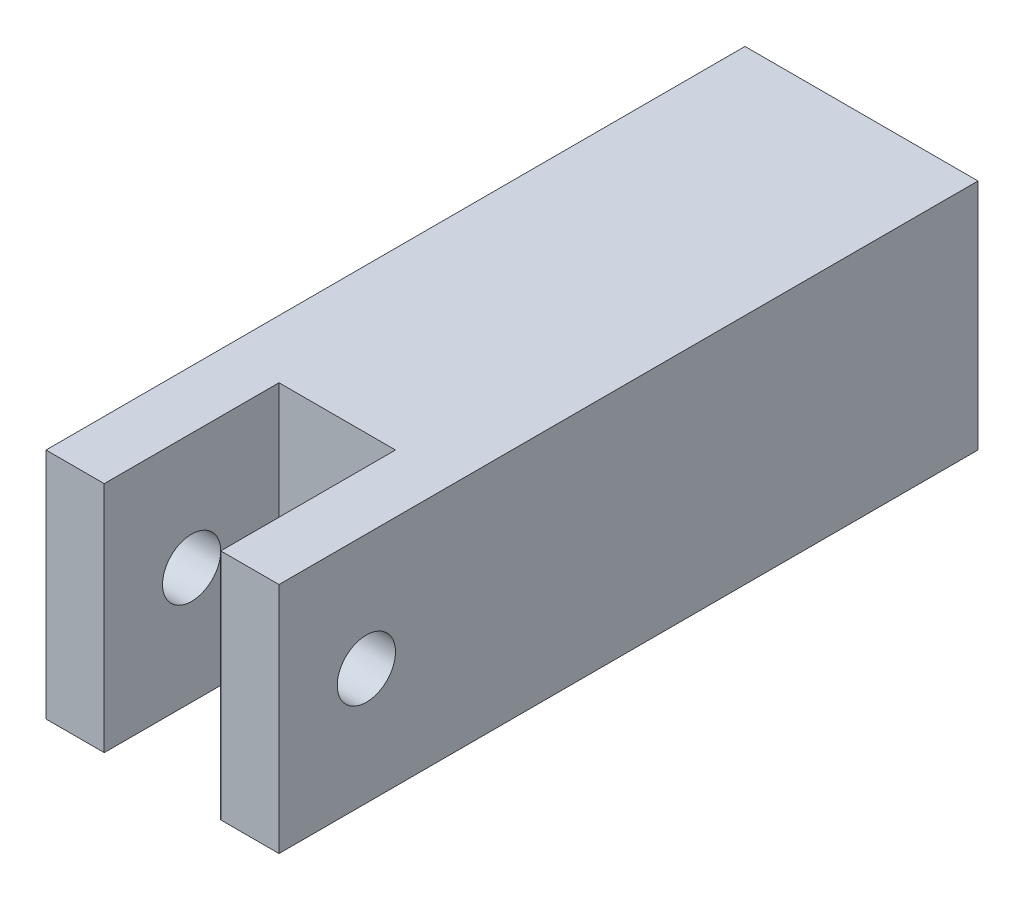
ISO-10303-21;
HEADER;
FILE_DESCRIPTION(('STEP AP214'),'2;1');
FILE_NAME('part.step','',(''),(''),'','','');
FILE_SCHEMA(('AUTOMOTIVE_DESIGN { 1 0 10303 214 1 1 1 1 }'));
ENDSEC;
DATA;
#1=APPLICATION_CONTEXT('core data for automotive mechanical design processes');
#2=APPLICATION_PROTOCOL_DEFINITION('international standard','automotive_design',2000,#1);
#3=PRODUCT_CONTEXT('',#1,'mechanical');
#4=PRODUCT('Part','Part','',(#3));
#5=PRODUCT_RELATED_PRODUCT_CATEGORY('part','',(#4));
#6=PRODUCT_DEFINITION_FORMATION('','',#4);
#7=PRODUCT_DEFINITION_CONTEXT('part definition',#1,'design');
#8=PRODUCT_DEFINITION('design','',#6,#7);
#9=PRODUCT_DEFINITION_SHAPE('','',#8);
#10=(LENGTH_UNIT() NAMED_UNIT(*) SI_UNIT(.MILLI.,.METRE.));
#11=(NAMED_UNIT(*) PLANE_ANGLE_UNIT() SI_UNIT($,.RADIAN.));
#12=(NAMED_UNIT(*) SI_UNIT($,.STERADIAN.) SOLID_ANGLE_UNIT());
#13=UNCERTAINTY_MEASURE_WITH_UNIT(LENGTH_MEASURE(1.E-05),#10,'distance_accuracy_value','');
#14=(GEOMETRIC_REPRESENTATION_CONTEXT(3) GLOBAL_UNCERTAINTY_ASSIGNED_CONTEXT((#13)) GLOBAL_UNIT_ASSIGNED_CONTEXT((#10,
#11,#12)) REPRESENTATION_CONTEXT('',''));
#15=CARTESIAN_POINT('',(0.,0.,0.));
#16=DIRECTION('',(0.,0.,1.));
#17=DIRECTION('',(1.,0.,0.));
#18=AXIS2_PLACEMENT_3D('',#15,#16,#17);
#19=CARTESIAN_POINT('',(0.,0.,90.));
#20=DIRECTION('',(0.,0.,1.));
#21=DIRECTION('',(1.,0.,0.));
#22=AXIS2_PLACEMENT_3D('',#19,#20,#21);
#23=PLANE('',#22);
#24=DIRECTION('',(-1.,0.,0.));
#25=VECTOR('',#24,1.);
#26=CARTESIAN_POINT('',(-20.,20.,90.));
#27=LINE('',#26,#25);
#28=CARTESIAN_POINT('',(10.,20.,90.));
#29=VERTEX_POINT('',#28);
#30=CARTESIAN_POINT('',(-9.99999999999999,20.,90.));
#31=VERTEX_POINT('',#30);
#32=EDGE_CURVE('E60',#29,#31,#27,.T.);
#33=ORIENTED_EDGE('',*,*,#32,.T.);
#34=DIRECTION('',(0.,1.,0.));
#35=VECTOR('',#34,1.);
#36=CARTESIAN_POINT('',(-9.99999999999999,-20.,90.));
#37=LINE('',#36,#35);
#38=CARTESIAN_POINT('',(-9.99999999999999,-20.,90.));
#39=VERTEX_POINT('',#38);
#40=EDGE_CURVE('E55',#39,#31,#37,.T.);
#41=ORIENTED_EDGE('',*,*,#40,.F.);
#42=DIRECTION('',(1.,0.,0.));
#43=VECTOR('',#42,1.);
#44=CARTESIAN_POINT('',(-20.,-20.,90.));
#45=LINE('',#44,#43);
#46=CARTESIAN_POINT('',(10.,-20.,90.));
#47=VERTEX_POINT('',#46);
#48=EDGE_CURVE('E152',#39,#47,#45,.T.);
#49=ORIENTED_EDGE('',*,*,#48,.T.);
#50=DIRECTION('',(0.,-1.,0.));
#51=VECTOR('',#50,1.);
#52=CARTESIAN_POINT('',(10.,-20.,90.));
#53=LINE('',#52,#51);
#54=EDGE_CURVE('E127',#29,#47,#53,.T.);
#55=ORIENTED_EDGE('',*,*,#54,.F.);
#56=EDGE_LOOP('',(#33,#41,#49,#55));
#57=FACE_BOUND('',#56,.T.);
#58=ADVANCED_FACE('F39',(#57),#23,.T.);
#59=CARTESIAN_POINT('',(20.,20.,90.));
#60=DIRECTION('',(-1.,0.,0.));
#61=DIRECTION('',(0.,-1.,0.));
#62=AXIS2_PLACEMENT_3D('',#59,#60,#61);
#63=PLANE('',#62);
#64=CARTESIAN_POINT('',(20.,0.,105.));
#65=DIRECTION('',(-1.,0.,0.));
#66=DIRECTION('',(0.,-1.,0.));
#67=AXIS2_PLACEMENT_3D('',#64,#65,#66);
#68=CIRCLE('',#67,5.);
#69=CARTESIAN_POINT('',(20.,-5.,105.));
#70=VERTEX_POINT('',#69);
#71=EDGE_CURVE('E195',#70,#70,#68,.T.);
#72=ORIENTED_EDGE('',*,*,#71,.T.);
#73=EDGE_LOOP('',(#72));
#74=FACE_BOUND('',#73,.T.);
#75=DIRECTION('',(0.,1.,0.));
#76=VECTOR('',#75,1.);
#77=CARTESIAN_POINT('',(20.,20.,0.));
#78=LINE('',#77,#76);
#79=CARTESIAN_POINT('',(20.,-20.,0.));
#80=VERTEX_POINT('',#79);
#81=CARTESIAN_POINT('',(20.,20.,0.));
#82=VERTEX_POINT('',#81);
#83=EDGE_CURVE('E150',#80,#82,#78,.T.);
#84=ORIENTED_EDGE('',*,*,#83,.T.);
#85=DIRECTION('',(0.,0.,-1.));
#86=VECTOR('',#85,1.);
#87=CARTESIAN_POINT('',(20.,20.,90.));
#88=LINE('',#87,#86);
#89=CARTESIAN_POINT('',(20.,20.,120.));
#90=VERTEX_POINT('',#89);
#91=EDGE_CURVE('E11',#90,#82,#88,.T.);
#92=ORIENTED_EDGE('',*,*,#91,.F.);
#93=DIRECTION('',(0.,1.,0.));
#94=VECTOR('',#93,1.);
#95=CARTESIAN_POINT('',(20.,-20.,120.));
#96=LINE('',#95,#94);
#97=CARTESIAN_POINT('',(20.,-20.,120.));
#98=VERTEX_POINT('',#97);
#99=EDGE_CURVE('E132',#98,#90,#96,.T.);
#100=ORIENTED_EDGE('',*,*,#99,.F.);
#101=DIRECTION('',(0.,0.,-1.));
#102=VECTOR('',#101,1.);
#103=CARTESIAN_POINT('',(20.,-20.,90.));
#104=LINE('',#103,#102);
#105=EDGE_CURVE('E155',#98,#80,#104,.T.);
#106=ORIENTED_EDGE('',*,*,#105,.T.);
#107=EDGE_LOOP('',(#84,#92,#100,#106));
#108=FACE_BOUND('',#107,.T.);
#109=ADVANCED_FACE('F41',(#74,#108),#63,.F.);
#110=CARTESIAN_POINT('',(-20.,20.,90.));
#111=DIRECTION('',(0.,-1.,0.));
#112=DIRECTION('',(0.,0.,-1.));
#113=AXIS2_PLACEMENT_3D('',#110,#111,#112);
#114=PLANE('',#113);
#115=DIRECTION('',(-1.,0.,0.));
#116=VECTOR('',#115,1.);
#117=CARTESIAN_POINT('',(-20.,20.,0.));
#118=LINE('',#117,#116);
#119=CARTESIAN_POINT('',(-20.,20.,0.));
#120=VERTEX_POINT('',#119);
#121=EDGE_CURVE('E107',#82,#120,#118,.T.);
#122=ORIENTED_EDGE('',*,*,#121,.T.);
#123=DIRECTION('',(0.,0.,-1.));
#124=VECTOR('',#123,1.);
#125=CARTESIAN_POINT('',(-20.,20.,90.));
#126=LINE('',#125,#124);
#127=CARTESIAN_POINT('',(-20.,20.,120.));
#128=VERTEX_POINT('',#127);
#129=EDGE_CURVE('E48',#128,#120,#126,.T.);
#130=ORIENTED_EDGE('',*,*,#129,.F.);
#131=DIRECTION('',(-1.,0.,0.));
#132=VECTOR('',#131,1.);
#133=CARTESIAN_POINT('',(-20.,20.,120.));
#134=LINE('',#133,#132);
#135=CARTESIAN_POINT('',(-9.99999999999999,20.,120.));
#136=VERTEX_POINT('',#135);
#137=EDGE_CURVE('E106',#136,#128,#134,.T.);
#138=ORIENTED_EDGE('',*,*,#137,.F.);
#139=DIRECTION('',(0.,0.,-1.));
#140=VECTOR('',#139,1.);
#141=CARTESIAN_POINT('',(-9.99999999999999,20.,120.));
#142=LINE('',#141,#140);
#143=EDGE_CURVE('E120',#136,#31,#142,.T.);
#144=ORIENTED_EDGE('',*,*,#143,.T.);
#145=ORIENTED_EDGE('',*,*,#32,.F.);
#146=DIRECTION('',(0.,0.,-1.));
#147=VECTOR('',#146,1.);
#148=CARTESIAN_POINT('',(10.,20.,120.));
#149=LINE('',#148,#147);
#150=CARTESIAN_POINT('',(10.,20.,120.));
#151=VERTEX_POINT('',#150);
#152=EDGE_CURVE('E147',#151,#29,#149,.T.);
#153=ORIENTED_EDGE('',*,*,#152,.F.);
#154=DIRECTION('',(-1.,0.,0.));
#155=VECTOR('',#154,1.);
#156=CARTESIAN_POINT('',(20.,20.,120.));
#157=LINE('',#156,#155);
#158=EDGE_CURVE('E135',#90,#151,#157,.T.);
#159=ORIENTED_EDGE('',*,*,#158,.F.);
#160=ORIENTED_EDGE('',*,*,#91,.T.);
#161=EDGE_LOOP('',(#122,#130,#138,#144,#145,#153,#159,#160));
#162=FACE_BOUND('',#161,.T.);
#163=ADVANCED_FACE('F104',(#162),#114,.F.);
#164=CARTESIAN_POINT('',(-20.,20.,90.));
#165=DIRECTION('',(1.,0.,0.));
#166=DIRECTION('',(0.,1.,0.));
#167=AXIS2_PLACEMENT_3D('',#164,#165,#166);
#168=PLANE('',#167);
#169=CARTESIAN_POINT('',(-20.,0.,105.));
#170=DIRECTION('',(-1.,0.,0.));
#171=DIRECTION('',(0.,-1.,0.));
#172=AXIS2_PLACEMENT_3D('',#169,#170,#171);
#173=CIRCLE('',#172,5.);
#174=CARTESIAN_POINT('',(-20.,-5.00000000000001,105.));
#175=VERTEX_POINT('',#174);
#176=EDGE_CURVE('E192',#175,#175,#173,.T.);
#177=ORIENTED_EDGE('',*,*,#176,.F.);
#178=EDGE_LOOP('',(#177));
#179=FACE_BOUND('',#178,.T.);
#180=DIRECTION('',(0.,-1.,0.));
#181=VECTOR('',#180,1.);
#182=CARTESIAN_POINT('',(-20.,20.,0.));
#183=LINE('',#182,#181);
#184=CARTESIAN_POINT('',(-20.,-20.,0.));
#185=VERTEX_POINT('',#184);
#186=EDGE_CURVE('E159',#120,#185,#183,.T.);
#187=ORIENTED_EDGE('',*,*,#186,.T.);
#188=DIRECTION('',(0.,0.,-1.));
#189=VECTOR('',#188,1.);
#190=CARTESIAN_POINT('',(-20.,-20.,90.));
#191=LINE('',#190,#189);
#192=CARTESIAN_POINT('',(-20.,-20.,120.));
#193=VERTEX_POINT('',#192);
#194=EDGE_CURVE('E111',#193,#185,#191,.T.);
#195=ORIENTED_EDGE('',*,*,#194,.F.);
#196=DIRECTION('',(0.,-1.,0.));
#197=VECTOR('',#196,1.);
#198=CARTESIAN_POINT('',(-20.,-20.,120.));
#199=LINE('',#198,#197);
#200=EDGE_CURVE('E116',#128,#193,#199,.T.);
#201=ORIENTED_EDGE('',*,*,#200,.F.);
#202=ORIENTED_EDGE('',*,*,#129,.T.);
#203=EDGE_LOOP('',(#187,#195,#201,#202));
#204=FACE_BOUND('',#203,.T.);
#205=ADVANCED_FACE('F122',(#179,#204),#168,.F.);
#206=CARTESIAN_POINT('',(-20.,-20.,90.));
#207=DIRECTION('',(0.,1.,0.));
#208=DIRECTION('',(0.,0.,1.));
#209=AXIS2_PLACEMENT_3D('',#206,#207,#208);
#210=PLANE('',#209);
#211=DIRECTION('',(1.,0.,0.));
#212=VECTOR('',#211,1.);
#213=CARTESIAN_POINT('',(-20.,-20.,0.));
#214=LINE('',#213,#212);
#215=EDGE_CURVE('E153',#185,#80,#214,.T.);
#216=ORIENTED_EDGE('',*,*,#215,.T.);
#217=ORIENTED_EDGE('',*,*,#105,.F.);
#218=DIRECTION('',(1.,0.,0.));
#219=VECTOR('',#218,1.);
#220=CARTESIAN_POINT('',(20.,-20.,120.));
#221=LINE('',#220,#219);
#222=CARTESIAN_POINT('',(10.,-20.,120.));
#223=VERTEX_POINT('',#222);
#224=EDGE_CURVE('E139',#223,#98,#221,.T.);
#225=ORIENTED_EDGE('',*,*,#224,.F.);
#226=DIRECTION('',(0.,0.,-1.));
#227=VECTOR('',#226,1.);
#228=CARTESIAN_POINT('',(10.,-20.,120.));
#229=LINE('',#228,#227);
#230=EDGE_CURVE('E142',#223,#47,#229,.T.);
#231=ORIENTED_EDGE('',*,*,#230,.T.);
#232=ORIENTED_EDGE('',*,*,#48,.F.);
#233=DIRECTION('',(0.,0.,-1.));
#234=VECTOR('',#233,1.);
#235=CARTESIAN_POINT('',(-9.99999999999999,-20.,120.));
#236=LINE('',#235,#234);
#237=CARTESIAN_POINT('',(-9.99999999999999,-20.,120.));
#238=VERTEX_POINT('',#237);
#239=EDGE_CURVE('E183',#238,#39,#236,.T.);
#240=ORIENTED_EDGE('',*,*,#239,.F.);
#241=DIRECTION('',(1.,0.,0.));
#242=VECTOR('',#241,1.);
#243=CARTESIAN_POINT('',(-20.,-20.,120.));
#244=LINE('',#243,#242);
#245=EDGE_CURVE('E125',#193,#238,#244,.T.);
#246=ORIENTED_EDGE('',*,*,#245,.F.);
#247=ORIENTED_EDGE('',*,*,#194,.T.);
#248=EDGE_LOOP('',(#216,#217,#225,#231,#232,#240,#246,#247));
#249=FACE_BOUND('',#248,.T.);
#250=ADVANCED_FACE('F166',(#249),#210,.F.);
#251=CARTESIAN_POINT('',(0.,0.,0.));
#252=DIRECTION('',(0.,0.,1.));
#253=DIRECTION('',(1.,0.,0.));
#254=AXIS2_PLACEMENT_3D('',#251,#252,#253);
#255=PLANE('',#254);
#256=CARTESIAN_POINT('',(0.,0.,0.));
#257=DIRECTION('',(0.,0.,-1.));
#258=DIRECTION('',(-1.,0.,0.));
#259=AXIS2_PLACEMENT_3D('',#256,#257,#258);
#260=CIRCLE('',#259,2.5);
#261=CARTESIAN_POINT('',(-2.5,0.,0.));
#262=VERTEX_POINT('',#261);
#263=EDGE_CURVE('E199',#262,#262,#260,.T.);
#264=ORIENTED_EDGE('',*,*,#263,.F.);
#265=EDGE_LOOP('',(#264));
#266=FACE_BOUND('',#265,.T.);
#267=ORIENTED_EDGE('',*,*,#83,.F.);
#268=ORIENTED_EDGE('',*,*,#215,.F.);
#269=ORIENTED_EDGE('',*,*,#186,.F.);
#270=ORIENTED_EDGE('',*,*,#121,.F.);
#271=EDGE_LOOP('',(#267,#268,#269,#270));
#272=FACE_BOUND('',#271,.T.);
#273=ADVANCED_FACE('F170',(#266,#272),#255,.F.);
#274=CARTESIAN_POINT('',(10.,-20.,120.));
#275=DIRECTION('',(1.,0.,0.));
#276=DIRECTION('',(0.,0.,-1.));
#277=AXIS2_PLACEMENT_3D('',#274,#275,#276);
#278=PLANE('',#277);
#279=CARTESIAN_POINT('',(10.,0.,105.));
#280=DIRECTION('',(1.,0.,0.));
#281=DIRECTION('',(0.,0.,-1.));
#282=AXIS2_PLACEMENT_3D('',#279,#280,#281);
#283=CIRCLE('',#282,5.);
#284=CARTESIAN_POINT('',(10.,0.,100.));
#285=VERTEX_POINT('',#284);
#286=EDGE_CURVE('E186',#285,#285,#283,.T.);
#287=ORIENTED_EDGE('',*,*,#286,.T.);
#288=EDGE_LOOP('',(#287));
#289=FACE_BOUND('',#288,.T.);
#290=ORIENTED_EDGE('',*,*,#54,.T.);
#291=ORIENTED_EDGE('',*,*,#230,.F.);
#292=DIRECTION('',(0.,-1.,0.));
#293=VECTOR('',#292,1.);
#294=CARTESIAN_POINT('',(10.,-20.,120.));
#295=LINE('',#294,#293);
#296=EDGE_CURVE('E137',#151,#223,#295,.T.);
#297=ORIENTED_EDGE('',*,*,#296,.F.);
#298=ORIENTED_EDGE('',*,*,#152,.T.);
#299=EDGE_LOOP('',(#290,#291,#297,#298));
#300=FACE_BOUND('',#299,.T.);
#301=ADVANCED_FACE('F181',(#289,#300),#278,.F.);
#302=CARTESIAN_POINT('',(0.,0.,120.));
#303=DIRECTION('',(0.,0.,1.));
#304=DIRECTION('',(1.,0.,0.));
#305=AXIS2_PLACEMENT_3D('',#302,#303,#304);
#306=PLANE('',#305);
#307=ORIENTED_EDGE('',*,*,#99,.T.);
#308=ORIENTED_EDGE('',*,*,#158,.T.);
#309=ORIENTED_EDGE('',*,*,#296,.T.);
#310=ORIENTED_EDGE('',*,*,#224,.T.);
#311=EDGE_LOOP('',(#307,#308,#309,#310));
#312=FACE_BOUND('',#311,.T.);
#313=ADVANCED_FACE('F176',(#312),#306,.T.);
#314=CARTESIAN_POINT('',(-9.99999999999999,-20.,120.));
#315=DIRECTION('',(-1.,0.,0.));
#316=DIRECTION('',(0.,-1.,0.));
#317=AXIS2_PLACEMENT_3D('',#314,#315,#316);
#318=PLANE('',#317);
#319=CARTESIAN_POINT('',(-9.99999999999999,0.,105.));
#320=DIRECTION('',(-1.,0.,0.));
#321=DIRECTION('',(0.,-1.,0.));
#322=AXIS2_PLACEMENT_3D('',#319,#320,#321);
#323=CIRCLE('',#322,5.);
#324=CARTESIAN_POINT('',(-9.99999999999999,-5.00000000000001,105.));
#325=VERTEX_POINT('',#324);
#326=EDGE_CURVE('E43',#325,#325,#323,.T.);
#327=ORIENTED_EDGE('',*,*,#326,.T.);
#328=EDGE_LOOP('',(#327));
#329=FACE_BOUND('',#328,.T.);
#330=ORIENTED_EDGE('',*,*,#40,.T.);
#331=ORIENTED_EDGE('',*,*,#143,.F.);
#332=DIRECTION('',(0.,1.,0.));
#333=VECTOR('',#332,1.);
#334=CARTESIAN_POINT('',(-9.99999999999999,-20.,120.));
#335=LINE('',#334,#333);
#336=EDGE_CURVE('E118',#238,#136,#335,.T.);
#337=ORIENTED_EDGE('',*,*,#336,.F.);
#338=ORIENTED_EDGE('',*,*,#239,.T.);
#339=EDGE_LOOP('',(#330,#331,#337,#338));
#340=FACE_BOUND('',#339,.T.);
#341=ADVANCED_FACE('F185',(#329,#340),#318,.F.);
#342=CARTESIAN_POINT('',(0.,0.,120.));
#343=DIRECTION('',(0.,0.,-1.));
#344=DIRECTION('',(-1.,0.,0.));
#345=AXIS2_PLACEMENT_3D('',#342,#343,#344);
#346=PLANE('',#345);
#347=ORIENTED_EDGE('',*,*,#200,.T.);
#348=ORIENTED_EDGE('',*,*,#245,.T.);
#349=ORIENTED_EDGE('',*,*,#336,.T.);
#350=ORIENTED_EDGE('',*,*,#137,.T.);
#351=EDGE_LOOP('',(#347,#348,#349,#350));
#352=FACE_BOUND('',#351,.T.);
#353=ADVANCED_FACE('F115',(#352),#346,.F.);
#354=CARTESIAN_POINT('',(20.,0.,105.));
#355=DIRECTION('',(-1.,0.,0.));
#356=DIRECTION('',(0.,-1.,0.));
#357=AXIS2_PLACEMENT_3D('',#354,#355,#356);
#358=CYLINDRICAL_SURFACE('',#357,5.);
#359=ORIENTED_EDGE('',*,*,#176,.T.);
#360=EDGE_LOOP('',(#359));
#361=FACE_BOUND('',#360,.T.);
#362=ORIENTED_EDGE('',*,*,#326,.F.);
#363=EDGE_LOOP('',(#362));
#364=FACE_BOUND('',#363,.T.);
#365=ADVANCED_FACE('F236',(#361,#364),#358,.F.);
#366=ORIENTED_EDGE('',*,*,#71,.F.);
#367=EDGE_LOOP('',(#366));
#368=FACE_BOUND('',#367,.T.);
#369=ORIENTED_EDGE('',*,*,#286,.F.);
#370=EDGE_LOOP('',(#369));
#371=FACE_BOUND('',#370,.T.);
#372=ADVANCED_FACE('F210',(#368,#371),#358,.F.);
#373=CARTESIAN_POINT('',(0.,0.,10.));
#374=DIRECTION('',(0.,0.,-1.));
#375=DIRECTION('',(-1.,0.,0.));
#376=AXIS2_PLACEMENT_3D('',#373,#374,#375);
#377=CYLINDRICAL_SURFACE('',#376,2.5);
#378=CARTESIAN_POINT('',(0.,0.,10.));
#379=DIRECTION('',(0.,0.,-1.));
#380=DIRECTION('',(-1.,0.,0.));
#381=AXIS2_PLACEMENT_3D('',#378,#379,#380);
#382=CIRCLE('',#381,2.5);
#383=CARTESIAN_POINT('',(-2.5,0.,10.));
#384=VERTEX_POINT('',#383);
#385=EDGE_CURVE('E196',#384,#384,#382,.T.);
#386=ORIENTED_EDGE('',*,*,#385,.F.);
#387=EDGE_LOOP('',(#386));
#388=FACE_BOUND('',#387,.T.);
#389=ORIENTED_EDGE('',*,*,#263,.T.);
#390=EDGE_LOOP('',(#389));
#391=FACE_BOUND('',#390,.T.);
#392=ADVANCED_FACE('F207',(#388,#391),#377,.F.);
#393=CARTESIAN_POINT('',(0.,0.,10.));
#394=DIRECTION('',(0.,0.,-1.));
#395=DIRECTION('',(-1.,0.,0.));
#396=AXIS2_PLACEMENT_3D('',#393,#394,#395);
#397=PLANE('',#396);
#398=ORIENTED_EDGE('',*,*,#385,.T.);
#399=EDGE_LOOP('',(#398));
#400=FACE_BOUND('',#399,.T.);
#401=ADVANCED_FACE('F205',(#400),#397,.T.);
#402=CLOSED_SHELL('',(#58,#109,#163,#205,#250,#273,#301,#313,#341,#353,#365,#372,#392,#401));
#403=MANIFOLD_SOLID_BREP('B2',#402);
#404=ADVANCED_BREP_SHAPE_REPRESENTATION('',(#18,#403),#14);
#405=SHAPE_DEFINITION_REPRESENTATION(#9,#404);
ENDSEC;
END-ISO-10303-21;
